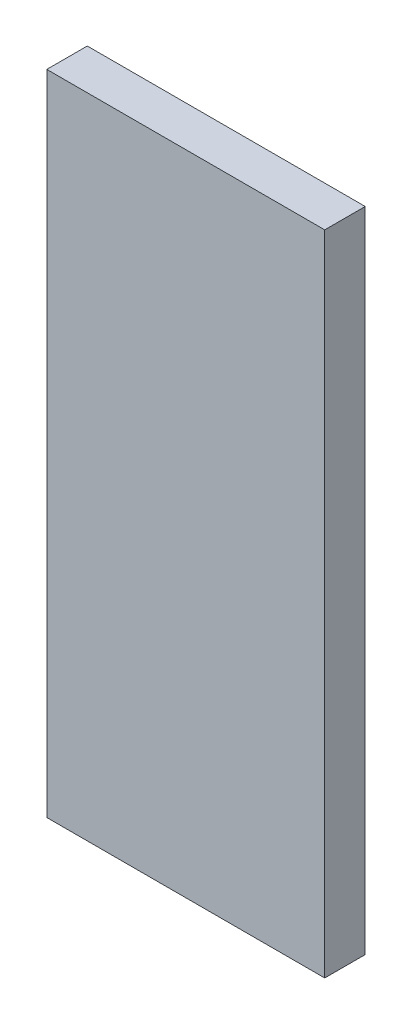
ISO-10303-21;
HEADER;
FILE_DESCRIPTION(('STEP AP214'),'2;1');
FILE_NAME('part.step','',(''),(''),'','','');
FILE_SCHEMA(('AUTOMOTIVE_DESIGN { 1 0 10303 214 1 1 1 1 }'));
ENDSEC;
DATA;
#1=APPLICATION_CONTEXT('core data for automotive mechanical design processes');
#2=APPLICATION_PROTOCOL_DEFINITION('international standard','automotive_design',2000,#1);
#3=PRODUCT_CONTEXT('',#1,'mechanical');
#4=PRODUCT('Part','Part','',(#3));
#5=PRODUCT_RELATED_PRODUCT_CATEGORY('part','',(#4));
#6=PRODUCT_DEFINITION_FORMATION('','',#4);
#7=PRODUCT_DEFINITION_CONTEXT('part definition',#1,'design');
#8=PRODUCT_DEFINITION('design','',#6,#7);
#9=PRODUCT_DEFINITION_SHAPE('','',#8);
#10=(LENGTH_UNIT() NAMED_UNIT(*) SI_UNIT(.MILLI.,.METRE.));
#11=(NAMED_UNIT(*) PLANE_ANGLE_UNIT() SI_UNIT($,.RADIAN.));
#12=(NAMED_UNIT(*) SI_UNIT($,.STERADIAN.) SOLID_ANGLE_UNIT());
#13=UNCERTAINTY_MEASURE_WITH_UNIT(LENGTH_MEASURE(1.E-05),#10,'distance_accuracy_value','');
#14=(GEOMETRIC_REPRESENTATION_CONTEXT(3) GLOBAL_UNCERTAINTY_ASSIGNED_CONTEXT((#13)) GLOBAL_UNIT_ASSIGNED_CONTEXT((#10,
#11,#12)) REPRESENTATION_CONTEXT('',''));
#15=CARTESIAN_POINT('',(0.,0.,0.));
#16=DIRECTION('',(0.,0.,1.));
#17=DIRECTION('',(1.,0.,0.));
#18=AXIS2_PLACEMENT_3D('',#15,#16,#17);
#19=CARTESIAN_POINT('',(-4.,8.,1.));
#20=DIRECTION('',(0.,0.,1.));
#21=DIRECTION('',(1.,0.,0.));
#22=AXIS2_PLACEMENT_3D('',#19,#20,#21);
#23=PLANE('',#22);
#24=DIRECTION('',(0.,1.,0.));
#25=VECTOR('',#24,1.);
#26=CARTESIAN_POINT('',(2.8635,8.,1.));
#27=LINE('',#26,#25);
#28=CARTESIAN_POINT('',(2.8635,8.,1.));
#29=VERTEX_POINT('',#28);
#30=CARTESIAN_POINT('',(2.8635,-8.,1.));
#31=VERTEX_POINT('',#30);
#32=EDGE_CURVE('E53',#29,#31,#27,.F.);
#33=ORIENTED_EDGE('',*,*,#32,.F.);
#34=DIRECTION('',(1.,0.,0.));
#35=VECTOR('',#34,1.);
#36=CARTESIAN_POINT('',(-4.,8.,1.));
#37=LINE('',#36,#35);
#38=CARTESIAN_POINT('',(-4.,8.,1.));
#39=VERTEX_POINT('',#38);
#40=EDGE_CURVE('E68',#39,#29,#37,.T.);
#41=ORIENTED_EDGE('',*,*,#40,.F.);
#42=DIRECTION('',(0.,1.,0.));
#43=VECTOR('',#42,1.);
#44=CARTESIAN_POINT('',(-4.,-8.,1.));
#45=LINE('',#44,#43);
#46=CARTESIAN_POINT('',(-4.,-8.,1.));
#47=VERTEX_POINT('',#46);
#48=EDGE_CURVE('E20',#47,#39,#45,.T.);
#49=ORIENTED_EDGE('',*,*,#48,.F.);
#50=DIRECTION('',(1.,0.,0.));
#51=VECTOR('',#50,1.);
#52=CARTESIAN_POINT('',(2.8635,-8.,1.));
#53=LINE('',#52,#51);
#54=EDGE_CURVE('E58',#31,#47,#53,.F.);
#55=ORIENTED_EDGE('',*,*,#54,.F.);
#56=EDGE_LOOP('',(#33,#41,#49,#55));
#57=FACE_BOUND('',#56,.T.);
#58=ADVANCED_FACE('F17',(#57),#23,.T.);
#59=CARTESIAN_POINT('',(-4.,-8.,0.));
#60=DIRECTION('',(-1.,0.,0.));
#61=DIRECTION('',(0.,0.,1.));
#62=AXIS2_PLACEMENT_3D('',#59,#60,#61);
#63=PLANE('',#62);
#64=DIRECTION('',(0.,0.,1.));
#65=VECTOR('',#64,1.);
#66=CARTESIAN_POINT('',(-4.,8.,0.));
#67=LINE('',#66,#65);
#68=CARTESIAN_POINT('',(-4.,8.,0.));
#69=VERTEX_POINT('',#68);
#70=EDGE_CURVE('E79',#69,#39,#67,.T.);
#71=ORIENTED_EDGE('',*,*,#70,.F.);
#72=DIRECTION('',(0.,1.,0.));
#73=VECTOR('',#72,1.);
#74=CARTESIAN_POINT('',(-4.,8.,0.));
#75=LINE('',#74,#73);
#76=CARTESIAN_POINT('',(-4.,-8.,0.));
#77=VERTEX_POINT('',#76);
#78=EDGE_CURVE('E74',#69,#77,#75,.F.);
#79=ORIENTED_EDGE('',*,*,#78,.T.);
#80=DIRECTION('',(0.,0.,-1.));
#81=VECTOR('',#80,1.);
#82=CARTESIAN_POINT('',(-4.,-8.,0.));
#83=LINE('',#82,#81);
#84=EDGE_CURVE('E63',#47,#77,#83,.T.);
#85=ORIENTED_EDGE('',*,*,#84,.F.);
#86=ORIENTED_EDGE('',*,*,#48,.T.);
#87=EDGE_LOOP('',(#71,#79,#85,#86));
#88=FACE_BOUND('',#87,.T.);
#89=ADVANCED_FACE('F73',(#88),#63,.T.);
#90=CARTESIAN_POINT('',(2.8635,-8.,0.));
#91=DIRECTION('',(0.,-1.,0.));
#92=DIRECTION('',(0.,0.,-1.));
#93=AXIS2_PLACEMENT_3D('',#90,#91,#92);
#94=PLANE('',#93);
#95=ORIENTED_EDGE('',*,*,#84,.T.);
#96=DIRECTION('',(1.,0.,0.));
#97=VECTOR('',#96,1.);
#98=CARTESIAN_POINT('',(-4.,-8.,0.));
#99=LINE('',#98,#97);
#100=CARTESIAN_POINT('',(2.8635,-8.,0.));
#101=VERTEX_POINT('',#100);
#102=EDGE_CURVE('E84',#77,#101,#99,.T.);
#103=ORIENTED_EDGE('',*,*,#102,.T.);
#104=DIRECTION('',(0.,0.,-1.));
#105=VECTOR('',#104,1.);
#106=CARTESIAN_POINT('',(2.8635,-8.,0.));
#107=LINE('',#106,#105);
#108=EDGE_CURVE('E65',#31,#101,#107,.T.);
#109=ORIENTED_EDGE('',*,*,#108,.F.);
#110=ORIENTED_EDGE('',*,*,#54,.T.);
#111=EDGE_LOOP('',(#95,#103,#109,#110));
#112=FACE_BOUND('',#111,.T.);
#113=ADVANCED_FACE('F60',(#112),#94,.T.);
#114=CARTESIAN_POINT('',(2.8635,8.,0.));
#115=DIRECTION('',(1.,0.,0.));
#116=DIRECTION('',(0.,0.,-1.));
#117=AXIS2_PLACEMENT_3D('',#114,#115,#116);
#118=PLANE('',#117);
#119=ORIENTED_EDGE('',*,*,#108,.T.);
#120=DIRECTION('',(0.,1.,0.));
#121=VECTOR('',#120,1.);
#122=CARTESIAN_POINT('',(2.8635,8.,0.));
#123=LINE('',#122,#121);
#124=CARTESIAN_POINT('',(2.8635,8.,0.));
#125=VERTEX_POINT('',#124);
#126=EDGE_CURVE('E26',#101,#125,#123,.T.);
#127=ORIENTED_EDGE('',*,*,#126,.T.);
#128=DIRECTION('',(0.,0.,1.));
#129=VECTOR('',#128,1.);
#130=CARTESIAN_POINT('',(2.8635,8.,0.));
#131=LINE('',#130,#129);
#132=EDGE_CURVE('E34',#29,#125,#131,.F.);
#133=ORIENTED_EDGE('',*,*,#132,.F.);
#134=ORIENTED_EDGE('',*,*,#32,.T.);
#135=EDGE_LOOP('',(#119,#127,#133,#134));
#136=FACE_BOUND('',#135,.T.);
#137=ADVANCED_FACE('F88',(#136),#118,.T.);
#138=CARTESIAN_POINT('',(-4.,8.,0.));
#139=DIRECTION('',(0.,1.,0.));
#140=DIRECTION('',(0.,0.,1.));
#141=AXIS2_PLACEMENT_3D('',#138,#139,#140);
#142=PLANE('',#141);
#143=ORIENTED_EDGE('',*,*,#132,.T.);
#144=DIRECTION('',(1.,0.,0.));
#145=VECTOR('',#144,1.);
#146=CARTESIAN_POINT('',(-4.,8.,0.));
#147=LINE('',#146,#145);
#148=EDGE_CURVE('E11',#125,#69,#147,.F.);
#149=ORIENTED_EDGE('',*,*,#148,.T.);
#150=ORIENTED_EDGE('',*,*,#70,.T.);
#151=ORIENTED_EDGE('',*,*,#40,.T.);
#152=EDGE_LOOP('',(#143,#149,#150,#151));
#153=FACE_BOUND('',#152,.T.);
#154=ADVANCED_FACE('F91',(#153),#142,.T.);
#155=CARTESIAN_POINT('',(-4.,8.,0.));
#156=DIRECTION('',(0.,0.,1.));
#157=DIRECTION('',(1.,0.,0.));
#158=AXIS2_PLACEMENT_3D('',#155,#156,#157);
#159=PLANE('',#158);
#160=ORIENTED_EDGE('',*,*,#126,.F.);
#161=ORIENTED_EDGE('',*,*,#102,.F.);
#162=ORIENTED_EDGE('',*,*,#78,.F.);
#163=ORIENTED_EDGE('',*,*,#148,.F.);
#164=EDGE_LOOP('',(#160,#161,#162,#163));
#165=FACE_BOUND('',#164,.T.);
#166=ADVANCED_FACE('F90',(#165),#159,.F.);
#167=CLOSED_SHELL('',(#58,#89,#113,#137,#154,#166));
#168=MANIFOLD_SOLID_BREP('B1',#167);
#169=ADVANCED_BREP_SHAPE_REPRESENTATION('',(#18,#168),#14);
#170=SHAPE_DEFINITION_REPRESENTATION(#9,#169);
ENDSEC;
END-ISO-10303-21;
